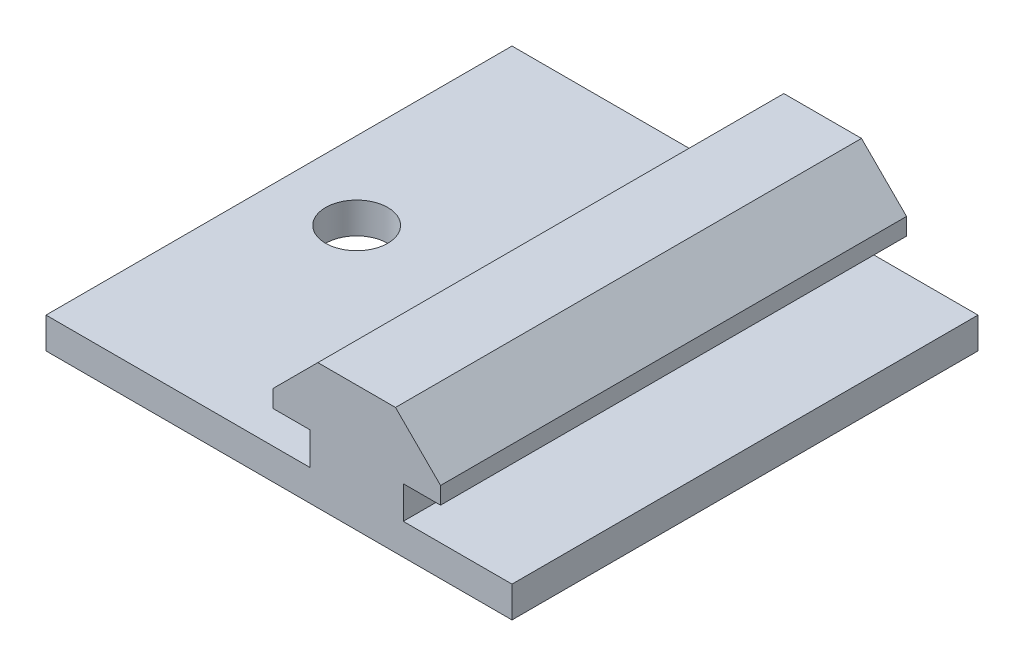
ISO-10303-21;
HEADER;
FILE_DESCRIPTION(('STEP AP214'),'2;1');
FILE_NAME('part.step','',(''),(''),'','','');
FILE_SCHEMA(('AUTOMOTIVE_DESIGN { 1 0 10303 214 1 1 1 1 }'));
ENDSEC;
DATA;
#1=APPLICATION_CONTEXT('core data for automotive mechanical design processes');
#2=APPLICATION_PROTOCOL_DEFINITION('international standard','automotive_design',2000,#1);
#3=PRODUCT_CONTEXT('',#1,'mechanical');
#4=PRODUCT('Part','Part','',(#3));
#5=PRODUCT_RELATED_PRODUCT_CATEGORY('part','',(#4));
#6=PRODUCT_DEFINITION_FORMATION('','',#4);
#7=PRODUCT_DEFINITION_CONTEXT('part definition',#1,'design');
#8=PRODUCT_DEFINITION('design','',#6,#7);
#9=PRODUCT_DEFINITION_SHAPE('','',#8);
#10=(LENGTH_UNIT() NAMED_UNIT(*) SI_UNIT(.MILLI.,.METRE.));
#11=(NAMED_UNIT(*) PLANE_ANGLE_UNIT() SI_UNIT($,.RADIAN.));
#12=(NAMED_UNIT(*) SI_UNIT($,.STERADIAN.) SOLID_ANGLE_UNIT());
#13=UNCERTAINTY_MEASURE_WITH_UNIT(LENGTH_MEASURE(1.E-05),#10,'distance_accuracy_value','');
#14=(GEOMETRIC_REPRESENTATION_CONTEXT(3) GLOBAL_UNCERTAINTY_ASSIGNED_CONTEXT((#13)) GLOBAL_UNIT_ASSIGNED_CONTEXT((#10,
#11,#12)) REPRESENTATION_CONTEXT('',''));
#15=CARTESIAN_POINT('',(0.,0.,0.));
#16=DIRECTION('',(0.,0.,1.));
#17=DIRECTION('',(1.,0.,0.));
#18=AXIS2_PLACEMENT_3D('',#15,#16,#17);
#19=CARTESIAN_POINT('',(-2.49999999999999,6.1,15.));
#20=DIRECTION('',(0.,-1.,0.));
#21=DIRECTION('',(0.,0.,-1.));
#22=AXIS2_PLACEMENT_3D('',#19,#20,#21);
#23=PLANE('',#22);
#24=DIRECTION('',(-1.,0.,0.));
#25=VECTOR('',#24,1.);
#26=CARTESIAN_POINT('',(-2.49999999999999,6.1,-15.));
#27=LINE('',#26,#25);
#28=CARTESIAN_POINT('',(2.49999999999999,6.1,-15.));
#29=VERTEX_POINT('',#28);
#30=CARTESIAN_POINT('',(-2.49999999999999,6.1,-15.));
#31=VERTEX_POINT('',#30);
#32=EDGE_CURVE('E180',#29,#31,#27,.T.);
#33=ORIENTED_EDGE('',*,*,#32,.T.);
#34=DIRECTION('',(0.,0.,-1.));
#35=VECTOR('',#34,1.);
#36=CARTESIAN_POINT('',(-2.49999999999999,6.1,15.));
#37=LINE('',#36,#35);
#38=CARTESIAN_POINT('',(-2.49999999999999,6.1,15.));
#39=VERTEX_POINT('',#38);
#40=EDGE_CURVE('E11',#39,#31,#37,.T.);
#41=ORIENTED_EDGE('',*,*,#40,.F.);
#42=DIRECTION('',(-1.,0.,0.));
#43=VECTOR('',#42,1.);
#44=CARTESIAN_POINT('',(-2.49999999999999,6.1,15.));
#45=LINE('',#44,#43);
#46=CARTESIAN_POINT('',(2.49999999999999,6.1,15.));
#47=VERTEX_POINT('',#46);
#48=EDGE_CURVE('E221',#47,#39,#45,.T.);
#49=ORIENTED_EDGE('',*,*,#48,.F.);
#50=DIRECTION('',(0.,0.,-1.));
#51=VECTOR('',#50,1.);
#52=CARTESIAN_POINT('',(2.49999999999999,6.1,15.));
#53=LINE('',#52,#51);
#54=EDGE_CURVE('E176',#47,#29,#53,.T.);
#55=ORIENTED_EDGE('',*,*,#54,.T.);
#56=EDGE_LOOP('',(#33,#41,#49,#55));
#57=FACE_BOUND('',#56,.T.);
#58=ADVANCED_FACE('F43',(#57),#23,.F.);
#59=CARTESIAN_POINT('',(-5.4,3.2,15.));
#60=DIRECTION('',(0.707106781186546,-0.707106781186549,0.));
#61=DIRECTION('',(0.707106781186549,0.707106781186546,0.));
#62=AXIS2_PLACEMENT_3D('',#59,#60,#61);
#63=PLANE('',#62);
#64=DIRECTION('',(-0.707106781186549,-0.707106781186546,0.));
#65=VECTOR('',#64,1.);
#66=CARTESIAN_POINT('',(-5.4,3.2,-15.));
#67=LINE('',#66,#65);
#68=CARTESIAN_POINT('',(-5.4,3.2,-15.));
#69=VERTEX_POINT('',#68);
#70=EDGE_CURVE('E184',#31,#69,#67,.T.);
#71=ORIENTED_EDGE('',*,*,#70,.T.);
#72=DIRECTION('',(0.,0.,-1.));
#73=VECTOR('',#72,1.);
#74=CARTESIAN_POINT('',(-5.4,3.2,15.));
#75=LINE('',#74,#73);
#76=CARTESIAN_POINT('',(-5.4,3.2,15.));
#77=VERTEX_POINT('',#76);
#78=EDGE_CURVE('E52',#77,#69,#75,.T.);
#79=ORIENTED_EDGE('',*,*,#78,.F.);
#80=DIRECTION('',(-0.707106781186549,-0.707106781186546,0.));
#81=VECTOR('',#80,1.);
#82=CARTESIAN_POINT('',(-5.4,3.2,15.));
#83=LINE('',#82,#81);
#84=EDGE_CURVE('E121',#39,#77,#83,.T.);
#85=ORIENTED_EDGE('',*,*,#84,.F.);
#86=ORIENTED_EDGE('',*,*,#40,.T.);
#87=EDGE_LOOP('',(#71,#79,#85,#86));
#88=FACE_BOUND('',#87,.T.);
#89=ADVANCED_FACE('F329',(#88),#63,.F.);
#90=CARTESIAN_POINT('',(-5.4,2.1,15.));
#91=DIRECTION('',(1.,0.,0.));
#92=DIRECTION('',(0.,0.,-1.));
#93=AXIS2_PLACEMENT_3D('',#90,#91,#92);
#94=PLANE('',#93);
#95=DIRECTION('',(0.,-1.,0.));
#96=VECTOR('',#95,1.);
#97=CARTESIAN_POINT('',(-5.4,2.1,-15.));
#98=LINE('',#97,#96);
#99=CARTESIAN_POINT('',(-5.4,2.1,-15.));
#100=VERTEX_POINT('',#99);
#101=EDGE_CURVE('E188',#69,#100,#98,.T.);
#102=ORIENTED_EDGE('',*,*,#101,.T.);
#103=DIRECTION('',(0.,0.,-1.));
#104=VECTOR('',#103,1.);
#105=CARTESIAN_POINT('',(-5.4,2.1,15.));
#106=LINE('',#105,#104);
#107=CARTESIAN_POINT('',(-5.4,2.1,15.));
#108=VERTEX_POINT('',#107);
#109=EDGE_CURVE('E256',#108,#100,#106,.T.);
#110=ORIENTED_EDGE('',*,*,#109,.F.);
#111=DIRECTION('',(0.,-1.,0.));
#112=VECTOR('',#111,1.);
#113=CARTESIAN_POINT('',(-5.4,2.1,15.));
#114=LINE('',#113,#112);
#115=EDGE_CURVE('E266',#77,#108,#114,.T.);
#116=ORIENTED_EDGE('',*,*,#115,.F.);
#117=ORIENTED_EDGE('',*,*,#78,.T.);
#118=EDGE_LOOP('',(#102,#110,#116,#117));
#119=FACE_BOUND('',#118,.T.);
#120=ADVANCED_FACE('F264',(#119),#94,.F.);
#121=CARTESIAN_POINT('',(-3.,2.1,15.));
#122=DIRECTION('',(0.,1.,0.));
#123=DIRECTION('',(-1.,0.,0.));
#124=AXIS2_PLACEMENT_3D('',#121,#122,#123);
#125=PLANE('',#124);
#126=DIRECTION('',(1.,0.,0.));
#127=VECTOR('',#126,1.);
#128=CARTESIAN_POINT('',(-3.,2.1,-15.));
#129=LINE('',#128,#127);
#130=CARTESIAN_POINT('',(-3.,2.1,-15.));
#131=VERTEX_POINT('',#130);
#132=EDGE_CURVE('E191',#100,#131,#129,.T.);
#133=ORIENTED_EDGE('',*,*,#132,.T.);
#134=DIRECTION('',(0.,0.,-1.));
#135=VECTOR('',#134,1.);
#136=CARTESIAN_POINT('',(-3.,2.1,15.));
#137=LINE('',#136,#135);
#138=CARTESIAN_POINT('',(-3.,2.1,15.));
#139=VERTEX_POINT('',#138);
#140=EDGE_CURVE('E252',#139,#131,#137,.T.);
#141=ORIENTED_EDGE('',*,*,#140,.F.);
#142=DIRECTION('',(1.,0.,0.));
#143=VECTOR('',#142,1.);
#144=CARTESIAN_POINT('',(-3.,2.1,15.));
#145=LINE('',#144,#143);
#146=EDGE_CURVE('E285',#108,#139,#145,.T.);
#147=ORIENTED_EDGE('',*,*,#146,.F.);
#148=ORIENTED_EDGE('',*,*,#109,.T.);
#149=EDGE_LOOP('',(#133,#141,#147,#148));
#150=FACE_BOUND('',#149,.T.);
#151=ADVANCED_FACE('F275',(#150),#125,.F.);
#152=CARTESIAN_POINT('',(-3.,2.1,15.));
#153=DIRECTION('',(1.,0.,0.));
#154=DIRECTION('',(0.,0.,-1.));
#155=AXIS2_PLACEMENT_3D('',#152,#153,#154);
#156=PLANE('',#155);
#157=DIRECTION('',(0.,-1.,0.));
#158=VECTOR('',#157,1.);
#159=CARTESIAN_POINT('',(-3.,2.1,-15.));
#160=LINE('',#159,#158);
#161=CARTESIAN_POINT('',(-3.,0.,-15.));
#162=VERTEX_POINT('',#161);
#163=EDGE_CURVE('E194',#131,#162,#160,.T.);
#164=ORIENTED_EDGE('',*,*,#163,.T.);
#165=DIRECTION('',(0.,0.,-1.));
#166=VECTOR('',#165,1.);
#167=CARTESIAN_POINT('',(-3.,0.,15.));
#168=LINE('',#167,#166);
#169=CARTESIAN_POINT('',(-3.,0.,15.));
#170=VERTEX_POINT('',#169);
#171=EDGE_CURVE('E248',#170,#162,#168,.T.);
#172=ORIENTED_EDGE('',*,*,#171,.F.);
#173=DIRECTION('',(0.,-1.,0.));
#174=VECTOR('',#173,1.);
#175=CARTESIAN_POINT('',(-3.,2.1,15.));
#176=LINE('',#175,#174);
#177=EDGE_CURVE('E281',#139,#170,#176,.T.);
#178=ORIENTED_EDGE('',*,*,#177,.F.);
#179=ORIENTED_EDGE('',*,*,#140,.T.);
#180=EDGE_LOOP('',(#164,#172,#178,#179));
#181=FACE_BOUND('',#180,.T.);
#182=ADVANCED_FACE('F279',(#181),#156,.F.);
#183=CARTESIAN_POINT('',(-3.,0.,15.));
#184=DIRECTION('',(0.,-1.,0.));
#185=DIRECTION('',(0.,0.,-1.));
#186=AXIS2_PLACEMENT_3D('',#183,#184,#185);
#187=PLANE('',#186);
#188=CARTESIAN_POINT('',(-15.,0.,0.));
#189=DIRECTION('',(0.,-1.,0.));
#190=DIRECTION('',(0.,0.,-1.));
#191=AXIS2_PLACEMENT_3D('',#188,#189,#190);
#192=CIRCLE('',#191,2.);
#193=CARTESIAN_POINT('',(-15.,0.,-2.));
#194=VERTEX_POINT('',#193);
#195=EDGE_CURVE('E503',#194,#194,#192,.T.);
#196=ORIENTED_EDGE('',*,*,#195,.T.);
#197=EDGE_LOOP('',(#196));
#198=FACE_BOUND('',#197,.T.);
#199=DIRECTION('',(-1.,0.,0.));
#200=VECTOR('',#199,1.);
#201=CARTESIAN_POINT('',(-3.,0.,-15.));
#202=LINE('',#201,#200);
#203=CARTESIAN_POINT('',(-20.,0.,-15.));
#204=VERTEX_POINT('',#203);
#205=EDGE_CURVE('E197',#162,#204,#202,.T.);
#206=ORIENTED_EDGE('',*,*,#205,.T.);
#207=DIRECTION('',(0.,0.,-1.));
#208=VECTOR('',#207,1.);
#209=CARTESIAN_POINT('',(-20.,0.,15.));
#210=LINE('',#209,#208);
#211=CARTESIAN_POINT('',(-20.,0.,15.));
#212=VERTEX_POINT('',#211);
#213=EDGE_CURVE('E244',#212,#204,#210,.T.);
#214=ORIENTED_EDGE('',*,*,#213,.F.);
#215=DIRECTION('',(-1.,0.,0.));
#216=VECTOR('',#215,1.);
#217=CARTESIAN_POINT('',(-3.,0.,15.));
#218=LINE('',#217,#216);
#219=EDGE_CURVE('E284',#170,#212,#218,.T.);
#220=ORIENTED_EDGE('',*,*,#219,.F.);
#221=ORIENTED_EDGE('',*,*,#171,.T.);
#222=EDGE_LOOP('',(#206,#214,#220,#221));
#223=FACE_BOUND('',#222,.T.);
#224=ADVANCED_FACE('F342',(#198,#223),#187,.F.);
#225=CARTESIAN_POINT('',(-20.,0.,15.));
#226=DIRECTION('',(1.,0.,0.));
#227=DIRECTION('',(0.,1.,0.));
#228=AXIS2_PLACEMENT_3D('',#225,#226,#227);
#229=PLANE('',#228);
#230=DIRECTION('',(0.,-1.,0.));
#231=VECTOR('',#230,1.);
#232=CARTESIAN_POINT('',(-20.,0.,-15.));
#233=LINE('',#232,#231);
#234=CARTESIAN_POINT('',(-20.,-2.,-15.));
#235=VERTEX_POINT('',#234);
#236=EDGE_CURVE('E200',#204,#235,#233,.T.);
#237=ORIENTED_EDGE('',*,*,#236,.T.);
#238=DIRECTION('',(0.,0.,-1.));
#239=VECTOR('',#238,1.);
#240=CARTESIAN_POINT('',(-20.,-2.,15.));
#241=LINE('',#240,#239);
#242=CARTESIAN_POINT('',(-20.,-2.,15.));
#243=VERTEX_POINT('',#242);
#244=EDGE_CURVE('E240',#243,#235,#241,.T.);
#245=ORIENTED_EDGE('',*,*,#244,.F.);
#246=DIRECTION('',(0.,-1.,0.));
#247=VECTOR('',#246,1.);
#248=CARTESIAN_POINT('',(-20.,0.,15.));
#249=LINE('',#248,#247);
#250=EDGE_CURVE('E289',#212,#243,#249,.T.);
#251=ORIENTED_EDGE('',*,*,#250,.F.);
#252=ORIENTED_EDGE('',*,*,#213,.T.);
#253=EDGE_LOOP('',(#237,#245,#251,#252));
#254=FACE_BOUND('',#253,.T.);
#255=ADVANCED_FACE('F345',(#254),#229,.F.);
#256=CARTESIAN_POINT('',(-20.,-2.,15.));
#257=DIRECTION('',(0.,1.,0.));
#258=DIRECTION('',(0.,0.,1.));
#259=AXIS2_PLACEMENT_3D('',#256,#257,#258);
#260=PLANE('',#259);
#261=CARTESIAN_POINT('',(-15.,-2.,0.));
#262=DIRECTION('',(0.,-1.,0.));
#263=DIRECTION('',(0.,0.,-1.));
#264=AXIS2_PLACEMENT_3D('',#261,#262,#263);
#265=CIRCLE('',#264,2.);
#266=CARTESIAN_POINT('',(-15.,-2.,-2.));
#267=VERTEX_POINT('',#266);
#268=EDGE_CURVE('E185',#267,#267,#265,.T.);
#269=ORIENTED_EDGE('',*,*,#268,.F.);
#270=EDGE_LOOP('',(#269));
#271=FACE_BOUND('',#270,.T.);
#272=DIRECTION('',(1.,0.,0.));
#273=VECTOR('',#272,1.);
#274=CARTESIAN_POINT('',(-20.,-2.,-15.));
#275=LINE('',#274,#273);
#276=CARTESIAN_POINT('',(10.,-2.,-15.));
#277=VERTEX_POINT('',#276);
#278=EDGE_CURVE('E203',#235,#277,#275,.T.);
#279=ORIENTED_EDGE('',*,*,#278,.T.);
#280=DIRECTION('',(0.,0.,-1.));
#281=VECTOR('',#280,1.);
#282=CARTESIAN_POINT('',(10.,-2.,15.));
#283=LINE('',#282,#281);
#284=CARTESIAN_POINT('',(10.,-2.,15.));
#285=VERTEX_POINT('',#284);
#286=EDGE_CURVE('E236',#285,#277,#283,.T.);
#287=ORIENTED_EDGE('',*,*,#286,.F.);
#288=DIRECTION('',(1.,0.,0.));
#289=VECTOR('',#288,1.);
#290=CARTESIAN_POINT('',(-20.,-2.,15.));
#291=LINE('',#290,#289);
#292=EDGE_CURVE('E296',#243,#285,#291,.T.);
#293=ORIENTED_EDGE('',*,*,#292,.F.);
#294=ORIENTED_EDGE('',*,*,#244,.T.);
#295=EDGE_LOOP('',(#279,#287,#293,#294));
#296=FACE_BOUND('',#295,.T.);
#297=ADVANCED_FACE('F349',(#271,#296),#260,.F.);
#298=CARTESIAN_POINT('',(10.,-2.,15.));
#299=DIRECTION('',(-1.,0.,0.));
#300=DIRECTION('',(0.,0.,1.));
#301=AXIS2_PLACEMENT_3D('',#298,#299,#300);
#302=PLANE('',#301);
#303=DIRECTION('',(0.,1.,0.));
#304=VECTOR('',#303,1.);
#305=CARTESIAN_POINT('',(10.,-2.,-15.));
#306=LINE('',#305,#304);
#307=CARTESIAN_POINT('',(10.,0.,-15.));
#308=VERTEX_POINT('',#307);
#309=EDGE_CURVE('E206',#277,#308,#306,.T.);
#310=ORIENTED_EDGE('',*,*,#309,.T.);
#311=DIRECTION('',(0.,0.,-1.));
#312=VECTOR('',#311,1.);
#313=CARTESIAN_POINT('',(10.,0.,15.));
#314=LINE('',#313,#312);
#315=CARTESIAN_POINT('',(10.,0.,15.));
#316=VERTEX_POINT('',#315);
#317=EDGE_CURVE('E232',#316,#308,#314,.T.);
#318=ORIENTED_EDGE('',*,*,#317,.F.);
#319=DIRECTION('',(0.,1.,0.));
#320=VECTOR('',#319,1.);
#321=CARTESIAN_POINT('',(10.,-2.,15.));
#322=LINE('',#321,#320);
#323=EDGE_CURVE('E299',#285,#316,#322,.T.);
#324=ORIENTED_EDGE('',*,*,#323,.F.);
#325=ORIENTED_EDGE('',*,*,#286,.T.);
#326=EDGE_LOOP('',(#310,#318,#324,#325));
#327=FACE_BOUND('',#326,.T.);
#328=ADVANCED_FACE('F353',(#327),#302,.F.);
#329=CARTESIAN_POINT('',(3.,0.,15.));
#330=DIRECTION('',(0.,-1.,0.));
#331=DIRECTION('',(0.,0.,-1.));
#332=AXIS2_PLACEMENT_3D('',#329,#330,#331);
#333=PLANE('',#332);
#334=DIRECTION('',(-1.,0.,0.));
#335=VECTOR('',#334,1.);
#336=CARTESIAN_POINT('',(3.,0.,-15.));
#337=LINE('',#336,#335);
#338=CARTESIAN_POINT('',(3.,0.,-15.));
#339=VERTEX_POINT('',#338);
#340=EDGE_CURVE('E209',#308,#339,#337,.T.);
#341=ORIENTED_EDGE('',*,*,#340,.T.);
#342=DIRECTION('',(0.,0.,-1.));
#343=VECTOR('',#342,1.);
#344=CARTESIAN_POINT('',(3.,0.,15.));
#345=LINE('',#344,#343);
#346=CARTESIAN_POINT('',(3.,0.,15.));
#347=VERTEX_POINT('',#346);
#348=EDGE_CURVE('E228',#347,#339,#345,.T.);
#349=ORIENTED_EDGE('',*,*,#348,.F.);
#350=DIRECTION('',(-1.,0.,0.));
#351=VECTOR('',#350,1.);
#352=CARTESIAN_POINT('',(3.,0.,15.));
#353=LINE('',#352,#351);
#354=EDGE_CURVE('E302',#316,#347,#353,.T.);
#355=ORIENTED_EDGE('',*,*,#354,.F.);
#356=ORIENTED_EDGE('',*,*,#317,.T.);
#357=EDGE_LOOP('',(#341,#349,#355,#356));
#358=FACE_BOUND('',#357,.T.);
#359=ADVANCED_FACE('F310',(#358),#333,.F.);
#360=CARTESIAN_POINT('',(3.,2.1,15.));
#361=DIRECTION('',(-1.,0.,0.));
#362=DIRECTION('',(0.,0.,1.));
#363=AXIS2_PLACEMENT_3D('',#360,#361,#362);
#364=PLANE('',#363);
#365=DIRECTION('',(0.,1.,0.));
#366=VECTOR('',#365,1.);
#367=CARTESIAN_POINT('',(3.,2.1,-15.));
#368=LINE('',#367,#366);
#369=CARTESIAN_POINT('',(3.,2.1,-15.));
#370=VERTEX_POINT('',#369);
#371=EDGE_CURVE('E212',#339,#370,#368,.T.);
#372=ORIENTED_EDGE('',*,*,#371,.T.);
#373=DIRECTION('',(0.,0.,-1.));
#374=VECTOR('',#373,1.);
#375=CARTESIAN_POINT('',(3.,2.1,15.));
#376=LINE('',#375,#374);
#377=CARTESIAN_POINT('',(3.,2.1,15.));
#378=VERTEX_POINT('',#377);
#379=EDGE_CURVE('E169',#378,#370,#376,.T.);
#380=ORIENTED_EDGE('',*,*,#379,.F.);
#381=DIRECTION('',(0.,1.,0.));
#382=VECTOR('',#381,1.);
#383=CARTESIAN_POINT('',(3.,2.1,15.));
#384=LINE('',#383,#382);
#385=EDGE_CURVE('E158',#347,#378,#384,.T.);
#386=ORIENTED_EDGE('',*,*,#385,.F.);
#387=ORIENTED_EDGE('',*,*,#348,.T.);
#388=EDGE_LOOP('',(#372,#380,#386,#387));
#389=FACE_BOUND('',#388,.T.);
#390=ADVANCED_FACE('F314',(#389),#364,.F.);
#391=CARTESIAN_POINT('',(3.,2.1,15.));
#392=DIRECTION('',(0.,1.,0.));
#393=DIRECTION('',(-1.,0.,0.));
#394=AXIS2_PLACEMENT_3D('',#391,#392,#393);
#395=PLANE('',#394);
#396=DIRECTION('',(1.,0.,0.));
#397=VECTOR('',#396,1.);
#398=CARTESIAN_POINT('',(3.,2.1,-15.));
#399=LINE('',#398,#397);
#400=CARTESIAN_POINT('',(5.4,2.1,-15.));
#401=VERTEX_POINT('',#400);
#402=EDGE_CURVE('E167',#370,#401,#399,.T.);
#403=ORIENTED_EDGE('',*,*,#402,.T.);
#404=DIRECTION('',(0.,0.,-1.));
#405=VECTOR('',#404,1.);
#406=CARTESIAN_POINT('',(5.4,2.1,15.));
#407=LINE('',#406,#405);
#408=CARTESIAN_POINT('',(5.4,2.1,15.));
#409=VERTEX_POINT('',#408);
#410=EDGE_CURVE('E164',#409,#401,#407,.T.);
#411=ORIENTED_EDGE('',*,*,#410,.F.);
#412=DIRECTION('',(1.,0.,0.));
#413=VECTOR('',#412,1.);
#414=CARTESIAN_POINT('',(3.,2.1,15.));
#415=LINE('',#414,#413);
#416=EDGE_CURVE('E152',#378,#409,#415,.T.);
#417=ORIENTED_EDGE('',*,*,#416,.F.);
#418=ORIENTED_EDGE('',*,*,#379,.T.);
#419=EDGE_LOOP('',(#403,#411,#417,#418));
#420=FACE_BOUND('',#419,.T.);
#421=ADVANCED_FACE('F165',(#420),#395,.F.);
#422=CARTESIAN_POINT('',(5.4,2.1,15.));
#423=DIRECTION('',(-1.,0.,0.));
#424=DIRECTION('',(0.,0.,1.));
#425=AXIS2_PLACEMENT_3D('',#422,#423,#424);
#426=PLANE('',#425);
#427=DIRECTION('',(0.,1.,0.));
#428=VECTOR('',#427,1.);
#429=CARTESIAN_POINT('',(5.4,2.1,-15.));
#430=LINE('',#429,#428);
#431=CARTESIAN_POINT('',(5.4,3.2,-15.));
#432=VERTEX_POINT('',#431);
#433=EDGE_CURVE('E107',#401,#432,#430,.T.);
#434=ORIENTED_EDGE('',*,*,#433,.T.);
#435=DIRECTION('',(0.,0.,-1.));
#436=VECTOR('',#435,1.);
#437=CARTESIAN_POINT('',(5.4,3.2,15.));
#438=LINE('',#437,#436);
#439=CARTESIAN_POINT('',(5.4,3.2,15.));
#440=VERTEX_POINT('',#439);
#441=EDGE_CURVE('E170',#440,#432,#438,.T.);
#442=ORIENTED_EDGE('',*,*,#441,.F.);
#443=DIRECTION('',(0.,1.,0.));
#444=VECTOR('',#443,1.);
#445=CARTESIAN_POINT('',(5.4,2.1,15.));
#446=LINE('',#445,#444);
#447=EDGE_CURVE('E156',#409,#440,#446,.T.);
#448=ORIENTED_EDGE('',*,*,#447,.F.);
#449=ORIENTED_EDGE('',*,*,#410,.T.);
#450=EDGE_LOOP('',(#434,#442,#448,#449));
#451=FACE_BOUND('',#450,.T.);
#452=ADVANCED_FACE('F172',(#451),#426,.F.);
#453=CARTESIAN_POINT('',(5.4,3.2,15.));
#454=DIRECTION('',(-0.707106781186546,-0.707106781186549,0.));
#455=DIRECTION('',(0.707106781186549,-0.707106781186546,0.));
#456=AXIS2_PLACEMENT_3D('',#453,#454,#455);
#457=PLANE('',#456);
#458=DIRECTION('',(-0.707106781186549,0.707106781186546,0.));
#459=VECTOR('',#458,1.);
#460=CARTESIAN_POINT('',(5.4,3.2,-15.));
#461=LINE('',#460,#459);
#462=EDGE_CURVE('E113',#432,#29,#461,.T.);
#463=ORIENTED_EDGE('',*,*,#462,.T.);
#464=ORIENTED_EDGE('',*,*,#54,.F.);
#465=DIRECTION('',(-0.707106781186549,0.707106781186546,0.));
#466=VECTOR('',#465,1.);
#467=CARTESIAN_POINT('',(5.4,3.2,15.));
#468=LINE('',#467,#466);
#469=EDGE_CURVE('E60',#440,#47,#468,.T.);
#470=ORIENTED_EDGE('',*,*,#469,.F.);
#471=ORIENTED_EDGE('',*,*,#441,.T.);
#472=EDGE_LOOP('',(#463,#464,#470,#471));
#473=FACE_BOUND('',#472,.T.);
#474=ADVANCED_FACE('F318',(#473),#457,.F.);
#475=CARTESIAN_POINT('',(0.,0.,15.));
#476=DIRECTION('',(0.,0.,1.));
#477=DIRECTION('',(1.,0.,0.));
#478=AXIS2_PLACEMENT_3D('',#475,#476,#477);
#479=PLANE('',#478);
#480=ORIENTED_EDGE('',*,*,#48,.T.);
#481=ORIENTED_EDGE('',*,*,#84,.T.);
#482=ORIENTED_EDGE('',*,*,#115,.T.);
#483=ORIENTED_EDGE('',*,*,#146,.T.);
#484=ORIENTED_EDGE('',*,*,#177,.T.);
#485=ORIENTED_EDGE('',*,*,#219,.T.);
#486=ORIENTED_EDGE('',*,*,#250,.T.);
#487=ORIENTED_EDGE('',*,*,#292,.T.);
#488=ORIENTED_EDGE('',*,*,#323,.T.);
#489=ORIENTED_EDGE('',*,*,#354,.T.);
#490=ORIENTED_EDGE('',*,*,#385,.T.);
#491=ORIENTED_EDGE('',*,*,#416,.T.);
#492=ORIENTED_EDGE('',*,*,#447,.T.);
#493=ORIENTED_EDGE('',*,*,#469,.T.);
#494=EDGE_LOOP('',(#480,#481,#482,#483,#484,#485,#486,#487,#488,#489,#490,#491,#492,#493));
#495=FACE_BOUND('',#494,.T.);
#496=ADVANCED_FACE('F154',(#495),#479,.T.);
#497=CARTESIAN_POINT('',(0.,0.,-15.));
#498=DIRECTION('',(0.,0.,1.));
#499=DIRECTION('',(1.,0.,0.));
#500=AXIS2_PLACEMENT_3D('',#497,#498,#499);
#501=PLANE('',#500);
#502=ORIENTED_EDGE('',*,*,#32,.F.);
#503=ORIENTED_EDGE('',*,*,#462,.F.);
#504=ORIENTED_EDGE('',*,*,#433,.F.);
#505=ORIENTED_EDGE('',*,*,#402,.F.);
#506=ORIENTED_EDGE('',*,*,#371,.F.);
#507=ORIENTED_EDGE('',*,*,#340,.F.);
#508=ORIENTED_EDGE('',*,*,#309,.F.);
#509=ORIENTED_EDGE('',*,*,#278,.F.);
#510=ORIENTED_EDGE('',*,*,#236,.F.);
#511=ORIENTED_EDGE('',*,*,#205,.F.);
#512=ORIENTED_EDGE('',*,*,#163,.F.);
#513=ORIENTED_EDGE('',*,*,#132,.F.);
#514=ORIENTED_EDGE('',*,*,#101,.F.);
#515=ORIENTED_EDGE('',*,*,#70,.F.);
#516=EDGE_LOOP('',(#502,#503,#504,#505,#506,#507,#508,#509,#510,#511,#512,#513,#514,#515));
#517=FACE_BOUND('',#516,.T.);
#518=ADVANCED_FACE('F270',(#517),#501,.F.);
#519=CARTESIAN_POINT('',(-15.,-2.,0.));
#520=DIRECTION('',(0.,1.,0.));
#521=DIRECTION('',(0.,0.,1.));
#522=AXIS2_PLACEMENT_3D('',#519,#520,#521);
#523=CYLINDRICAL_SURFACE('',#522,2.);
#524=ORIENTED_EDGE('',*,*,#268,.T.);
#525=EDGE_LOOP('',(#524));
#526=FACE_BOUND('',#525,.T.);
#527=ORIENTED_EDGE('',*,*,#195,.F.);
#528=EDGE_LOOP('',(#527));
#529=FACE_BOUND('',#528,.T.);
#530=ADVANCED_FACE('F393',(#526,#529),#523,.F.);
#531=CLOSED_SHELL('',(#58,#89,#120,#151,#182,#224,#255,#297,#328,#359,#390,#421,#452,#474,#496,
#518,#530));
#532=MANIFOLD_SOLID_BREP('B2',#531);
#533=ADVANCED_BREP_SHAPE_REPRESENTATION('',(#18,#532),#14);
#534=SHAPE_DEFINITION_REPRESENTATION(#9,#533);
ENDSEC;
END-ISO-10303-21;
